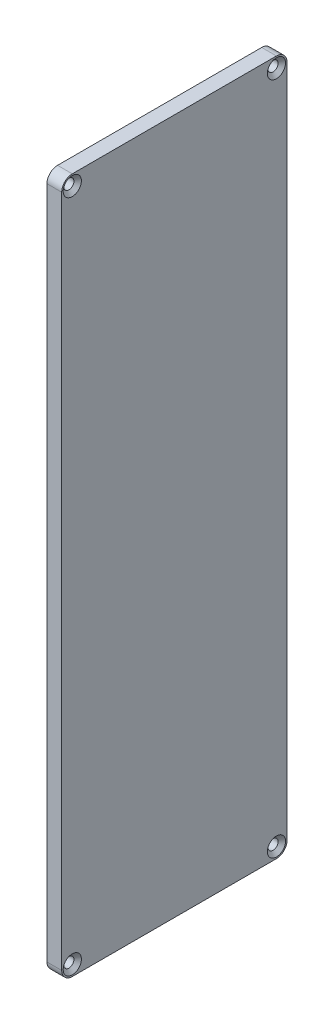
ISO-10303-21;
HEADER;
FILE_DESCRIPTION(('STEP AP214'),'2;1');
FILE_NAME('part.step','',(''),(''),'','','');
FILE_SCHEMA(('AUTOMOTIVE_DESIGN { 1 0 10303 214 1 1 1 1 }'));
ENDSEC;
DATA;
#1=APPLICATION_CONTEXT('core data for automotive mechanical design processes');
#2=APPLICATION_PROTOCOL_DEFINITION('international standard','automotive_design',2000,#1);
#3=PRODUCT_CONTEXT('',#1,'mechanical');
#4=PRODUCT('Part','Part','',(#3));
#5=PRODUCT_RELATED_PRODUCT_CATEGORY('part','',(#4));
#6=PRODUCT_DEFINITION_FORMATION('','',#4);
#7=PRODUCT_DEFINITION_CONTEXT('part definition',#1,'design');
#8=PRODUCT_DEFINITION('design','',#6,#7);
#9=PRODUCT_DEFINITION_SHAPE('','',#8);
#10=(LENGTH_UNIT() NAMED_UNIT(*) SI_UNIT(.MILLI.,.METRE.));
#11=(NAMED_UNIT(*) PLANE_ANGLE_UNIT() SI_UNIT($,.RADIAN.));
#12=(NAMED_UNIT(*) SI_UNIT($,.STERADIAN.) SOLID_ANGLE_UNIT());
#13=UNCERTAINTY_MEASURE_WITH_UNIT(LENGTH_MEASURE(1.E-05),#10,'distance_accuracy_value','');
#14=(GEOMETRIC_REPRESENTATION_CONTEXT(3) GLOBAL_UNCERTAINTY_ASSIGNED_CONTEXT((#13)) GLOBAL_UNIT_ASSIGNED_CONTEXT((#10,
#11,#12)) REPRESENTATION_CONTEXT('',''));
#15=CARTESIAN_POINT('',(0.,0.,0.));
#16=DIRECTION('',(0.,0.,1.));
#17=DIRECTION('',(1.,0.,0.));
#18=AXIS2_PLACEMENT_3D('',#15,#16,#17);
#19=CARTESIAN_POINT('',(151.859564679865,-68.6434992731308,22.0654459774263));
#20=DIRECTION('',(-1.,0.,0.));
#21=DIRECTION('',(0.,0.,1.));
#22=AXIS2_PLACEMENT_3D('',#19,#20,#21);
#23=CYLINDRICAL_SURFACE('',#22,2.159);
#24=CARTESIAN_POINT('',(3.,-68.6434992731308,22.0654459774263));
#25=DIRECTION('',(1.,0.,0.));
#26=DIRECTION('',(0.,0.,-1.));
#27=AXIS2_PLACEMENT_3D('',#24,#25,#26);
#28=CIRCLE('',#27,2.159);
#29=CARTESIAN_POINT('',(3.,-68.6434992731308,24.2244459774263));
#30=VERTEX_POINT('',#29);
#31=CARTESIAN_POINT('',(3.,-70.8024992731308,22.0654459774263));
#32=VERTEX_POINT('',#31);
#33=EDGE_CURVE('E151',#30,#32,#28,.T.);
#34=ORIENTED_EDGE('',*,*,#33,.F.);
#35=DIRECTION('',(-1.,0.,0.));
#36=VECTOR('',#35,1.);
#37=CARTESIAN_POINT('',(151.859564679865,-68.6434992731308,24.2244459774263));
#38=LINE('',#37,#36);
#39=CARTESIAN_POINT('',(0.,-68.6434992731308,24.2244459774263));
#40=VERTEX_POINT('',#39);
#41=EDGE_CURVE('E47',#30,#40,#38,.T.);
#42=ORIENTED_EDGE('',*,*,#41,.T.);
#43=CARTESIAN_POINT('',(0.,-68.6434992731308,22.0654459774263));
#44=DIRECTION('',(1.,0.,0.));
#45=DIRECTION('',(0.,0.,-1.));
#46=AXIS2_PLACEMENT_3D('',#43,#44,#45);
#47=CIRCLE('',#46,2.159);
#48=CARTESIAN_POINT('',(0.,-70.8024992731308,22.0654459774263));
#49=VERTEX_POINT('',#48);
#50=EDGE_CURVE('E165',#40,#49,#47,.T.);
#51=ORIENTED_EDGE('',*,*,#50,.T.);
#52=DIRECTION('',(-1.,0.,0.));
#53=VECTOR('',#52,1.);
#54=CARTESIAN_POINT('',(151.859564679865,-70.8024992731308,22.0654459774263));
#55=LINE('',#54,#53);
#56=EDGE_CURVE('E101',#32,#49,#55,.T.);
#57=ORIENTED_EDGE('',*,*,#56,.F.);
#58=EDGE_LOOP('',(#34,#42,#51,#57));
#59=FACE_BOUND('',#58,.T.);
#60=ADVANCED_FACE('F44',(#59),#23,.T.);
#61=CARTESIAN_POINT('',(151.859564679865,-70.8024992731308,22.0654459774263));
#62=DIRECTION('',(0.,1.,0.));
#63=DIRECTION('',(0.,0.,1.));
#64=AXIS2_PLACEMENT_3D('',#61,#62,#63);
#65=PLANE('',#64);
#66=DIRECTION('',(0.,0.,-1.));
#67=VECTOR('',#66,1.);
#68=CARTESIAN_POINT('',(3.,-70.8024992731308,22.0654459774263));
#69=LINE('',#68,#67);
#70=CARTESIAN_POINT('',(3.,-70.8024992731308,-19.5207410145249));
#71=VERTEX_POINT('',#70);
#72=EDGE_CURVE('E107',#32,#71,#69,.T.);
#73=ORIENTED_EDGE('',*,*,#72,.F.);
#74=ORIENTED_EDGE('',*,*,#56,.T.);
#75=DIRECTION('',(0.,0.,-1.));
#76=VECTOR('',#75,1.);
#77=CARTESIAN_POINT('',(0.,-70.8024992731308,22.0654459774263));
#78=LINE('',#77,#76);
#79=CARTESIAN_POINT('',(0.,-70.8024992731308,-19.5207410145249));
#80=VERTEX_POINT('',#79);
#81=EDGE_CURVE('E161',#49,#80,#78,.T.);
#82=ORIENTED_EDGE('',*,*,#81,.T.);
#83=DIRECTION('',(-1.,0.,0.));
#84=VECTOR('',#83,1.);
#85=CARTESIAN_POINT('',(151.859564679865,-70.8024992731308,-19.5207410145249));
#86=LINE('',#85,#84);
#87=EDGE_CURVE('E162',#71,#80,#86,.T.);
#88=ORIENTED_EDGE('',*,*,#87,.F.);
#89=EDGE_LOOP('',(#73,#74,#82,#88));
#90=FACE_BOUND('',#89,.T.);
#91=ADVANCED_FACE('F283',(#90),#65,.F.);
#92=CARTESIAN_POINT('',(151.859564679865,-68.6434992731308,-19.5207410145249));
#93=DIRECTION('',(-1.,0.,0.));
#94=DIRECTION('',(0.,0.,1.));
#95=AXIS2_PLACEMENT_3D('',#92,#93,#94);
#96=CYLINDRICAL_SURFACE('',#95,2.15899999999999);
#97=CARTESIAN_POINT('',(3.,-68.6434992731308,-19.5207410145249));
#98=DIRECTION('',(1.,0.,0.));
#99=DIRECTION('',(0.,0.,-1.));
#100=AXIS2_PLACEMENT_3D('',#97,#98,#99);
#101=CIRCLE('',#100,2.15899999999999);
#102=CARTESIAN_POINT('',(3.,-68.6434992731308,-21.6797410145249));
#103=VERTEX_POINT('',#102);
#104=EDGE_CURVE('E144',#71,#103,#101,.T.);
#105=ORIENTED_EDGE('',*,*,#104,.F.);
#106=ORIENTED_EDGE('',*,*,#87,.T.);
#107=CARTESIAN_POINT('',(0.,-68.6434992731308,-19.5207410145249));
#108=DIRECTION('',(1.,0.,0.));
#109=DIRECTION('',(0.,0.,-1.));
#110=AXIS2_PLACEMENT_3D('',#107,#108,#109);
#111=CIRCLE('',#110,2.15899999999999);
#112=CARTESIAN_POINT('',(0.,-68.6434992731308,-21.6797410145249));
#113=VERTEX_POINT('',#112);
#114=EDGE_CURVE('E167',#80,#113,#111,.T.);
#115=ORIENTED_EDGE('',*,*,#114,.T.);
#116=DIRECTION('',(-1.,0.,0.));
#117=VECTOR('',#116,1.);
#118=CARTESIAN_POINT('',(151.859564679865,-68.6434992731308,-21.6797410145249));
#119=LINE('',#118,#117);
#120=EDGE_CURVE('E170',#103,#113,#119,.T.);
#121=ORIENTED_EDGE('',*,*,#120,.F.);
#122=EDGE_LOOP('',(#105,#106,#115,#121));
#123=FACE_BOUND('',#122,.T.);
#124=ADVANCED_FACE('F281',(#123),#96,.T.);
#125=CARTESIAN_POINT('',(151.859564679865,-68.6434992731308,-21.6797410145249));
#126=DIRECTION('',(0.,0.,1.));
#127=DIRECTION('',(1.,0.,0.));
#128=AXIS2_PLACEMENT_3D('',#125,#126,#127);
#129=PLANE('',#128);
#130=DIRECTION('',(0.,1.,0.));
#131=VECTOR('',#130,1.);
#132=CARTESIAN_POINT('',(3.,-68.6434992731308,-21.6797410145249));
#133=LINE('',#132,#131);
#134=CARTESIAN_POINT('',(3.,68.6434992731308,-21.6797410145249));
#135=VERTEX_POINT('',#134);
#136=EDGE_CURVE('E138',#103,#135,#133,.T.);
#137=ORIENTED_EDGE('',*,*,#136,.F.);
#138=ORIENTED_EDGE('',*,*,#120,.T.);
#139=DIRECTION('',(0.,1.,0.));
#140=VECTOR('',#139,1.);
#141=CARTESIAN_POINT('',(0.,-68.6434992731308,-21.6797410145249));
#142=LINE('',#141,#140);
#143=CARTESIAN_POINT('',(0.,68.6434992731308,-21.6797410145249));
#144=VERTEX_POINT('',#143);
#145=EDGE_CURVE('E168',#113,#144,#142,.T.);
#146=ORIENTED_EDGE('',*,*,#145,.T.);
#147=DIRECTION('',(-1.,0.,0.));
#148=VECTOR('',#147,1.);
#149=CARTESIAN_POINT('',(151.859564679865,68.6434992731308,-21.6797410145249));
#150=LINE('',#149,#148);
#151=EDGE_CURVE('E173',#135,#144,#150,.T.);
#152=ORIENTED_EDGE('',*,*,#151,.F.);
#153=EDGE_LOOP('',(#137,#138,#146,#152));
#154=FACE_BOUND('',#153,.T.);
#155=ADVANCED_FACE('F289',(#154),#129,.F.);
#156=CARTESIAN_POINT('',(151.859564679865,68.6434992731308,-19.5207410145249));
#157=DIRECTION('',(-1.,0.,0.));
#158=DIRECTION('',(0.,0.,1.));
#159=AXIS2_PLACEMENT_3D('',#156,#157,#158);
#160=CYLINDRICAL_SURFACE('',#159,2.159);
#161=CARTESIAN_POINT('',(3.,68.6434992731308,-19.5207410145249));
#162=DIRECTION('',(1.,0.,0.));
#163=DIRECTION('',(0.,0.,-1.));
#164=AXIS2_PLACEMENT_3D('',#161,#162,#163);
#165=CIRCLE('',#164,2.159);
#166=CARTESIAN_POINT('',(3.,70.8024992731308,-19.5207410145249));
#167=VERTEX_POINT('',#166);
#168=EDGE_CURVE('E131',#135,#167,#165,.T.);
#169=ORIENTED_EDGE('',*,*,#168,.F.);
#170=ORIENTED_EDGE('',*,*,#151,.T.);
#171=CARTESIAN_POINT('',(0.,68.6434992731308,-19.5207410145249));
#172=DIRECTION('',(1.,0.,0.));
#173=DIRECTION('',(0.,0.,-1.));
#174=AXIS2_PLACEMENT_3D('',#171,#172,#173);
#175=CIRCLE('',#174,2.159);
#176=CARTESIAN_POINT('',(0.,70.8024992731308,-19.5207410145249));
#177=VERTEX_POINT('',#176);
#178=EDGE_CURVE('E175',#144,#177,#175,.T.);
#179=ORIENTED_EDGE('',*,*,#178,.T.);
#180=DIRECTION('',(-1.,0.,0.));
#181=VECTOR('',#180,1.);
#182=CARTESIAN_POINT('',(151.859564679865,70.8024992731308,-19.5207410145249));
#183=LINE('',#182,#181);
#184=EDGE_CURVE('E171',#167,#177,#183,.T.);
#185=ORIENTED_EDGE('',*,*,#184,.F.);
#186=EDGE_LOOP('',(#169,#170,#179,#185));
#187=FACE_BOUND('',#186,.T.);
#188=ADVANCED_FACE('F294',(#187),#160,.T.);
#189=CARTESIAN_POINT('',(151.859564679865,70.8024992731308,-19.5207410145249));
#190=DIRECTION('',(0.,-1.,0.));
#191=DIRECTION('',(0.,0.,-1.));
#192=AXIS2_PLACEMENT_3D('',#189,#190,#191);
#193=PLANE('',#192);
#194=DIRECTION('',(0.,0.,1.));
#195=VECTOR('',#194,1.);
#196=CARTESIAN_POINT('',(3.,70.8024992731308,-19.5207410145249));
#197=LINE('',#196,#195);
#198=CARTESIAN_POINT('',(3.,70.8024992731308,22.0654459774263));
#199=VERTEX_POINT('',#198);
#200=EDGE_CURVE('E54',#167,#199,#197,.T.);
#201=ORIENTED_EDGE('',*,*,#200,.F.);
#202=ORIENTED_EDGE('',*,*,#184,.T.);
#203=DIRECTION('',(0.,0.,1.));
#204=VECTOR('',#203,1.);
#205=CARTESIAN_POINT('',(0.,70.8024992731308,-19.5207410145249));
#206=LINE('',#205,#204);
#207=CARTESIAN_POINT('',(0.,70.8024992731308,22.0654459774263));
#208=VERTEX_POINT('',#207);
#209=EDGE_CURVE('E126',#177,#208,#206,.T.);
#210=ORIENTED_EDGE('',*,*,#209,.T.);
#211=DIRECTION('',(-1.,0.,0.));
#212=VECTOR('',#211,1.);
#213=CARTESIAN_POINT('',(151.859564679865,70.8024992731308,22.0654459774263));
#214=LINE('',#213,#212);
#215=EDGE_CURVE('E120',#199,#208,#214,.T.);
#216=ORIENTED_EDGE('',*,*,#215,.F.);
#217=EDGE_LOOP('',(#201,#202,#210,#216));
#218=FACE_BOUND('',#217,.T.);
#219=ADVANCED_FACE('F124',(#218),#193,.F.);
#220=CARTESIAN_POINT('',(151.859564679865,68.6434992731308,22.0654459774263));
#221=DIRECTION('',(-1.,0.,0.));
#222=DIRECTION('',(0.,0.,1.));
#223=AXIS2_PLACEMENT_3D('',#220,#221,#222);
#224=CYLINDRICAL_SURFACE('',#223,2.15900000000001);
#225=CARTESIAN_POINT('',(3.,68.6434992731308,22.0654459774263));
#226=DIRECTION('',(1.,0.,0.));
#227=DIRECTION('',(0.,0.,-1.));
#228=AXIS2_PLACEMENT_3D('',#225,#226,#227);
#229=CIRCLE('',#228,2.15900000000001);
#230=CARTESIAN_POINT('',(3.,68.6434992731308,24.2244459774263));
#231=VERTEX_POINT('',#230);
#232=EDGE_CURVE('E11',#199,#231,#229,.T.);
#233=ORIENTED_EDGE('',*,*,#232,.F.);
#234=ORIENTED_EDGE('',*,*,#215,.T.);
#235=CARTESIAN_POINT('',(0.,68.6434992731308,22.0654459774263));
#236=DIRECTION('',(1.,0.,0.));
#237=DIRECTION('',(0.,0.,-1.));
#238=AXIS2_PLACEMENT_3D('',#235,#236,#237);
#239=CIRCLE('',#238,2.15900000000001);
#240=CARTESIAN_POINT('',(0.,68.6434992731308,24.2244459774263));
#241=VERTEX_POINT('',#240);
#242=EDGE_CURVE('E133',#208,#241,#239,.T.);
#243=ORIENTED_EDGE('',*,*,#242,.T.);
#244=DIRECTION('',(-1.,0.,0.));
#245=VECTOR('',#244,1.);
#246=CARTESIAN_POINT('',(151.859564679865,68.6434992731308,24.2244459774263));
#247=LINE('',#246,#245);
#248=EDGE_CURVE('E67',#231,#241,#247,.T.);
#249=ORIENTED_EDGE('',*,*,#248,.F.);
#250=EDGE_LOOP('',(#233,#234,#243,#249));
#251=FACE_BOUND('',#250,.T.);
#252=ADVANCED_FACE('F117',(#251),#224,.T.);
#253=CARTESIAN_POINT('',(151.859564679865,68.6434992731308,24.2244459774263));
#254=DIRECTION('',(0.,0.,-1.));
#255=DIRECTION('',(0.,1.,0.));
#256=AXIS2_PLACEMENT_3D('',#253,#254,#255);
#257=PLANE('',#256);
#258=DIRECTION('',(0.,-1.,0.));
#259=VECTOR('',#258,1.);
#260=CARTESIAN_POINT('',(3.,68.6434992731308,24.2244459774263));
#261=LINE('',#260,#259);
#262=EDGE_CURVE('E154',#231,#30,#261,.T.);
#263=ORIENTED_EDGE('',*,*,#262,.F.);
#264=ORIENTED_EDGE('',*,*,#248,.T.);
#265=DIRECTION('',(0.,-1.,0.));
#266=VECTOR('',#265,1.);
#267=CARTESIAN_POINT('',(0.,68.6434992731308,24.2244459774263));
#268=LINE('',#267,#266);
#269=EDGE_CURVE('E158',#241,#40,#268,.T.);
#270=ORIENTED_EDGE('',*,*,#269,.T.);
#271=ORIENTED_EDGE('',*,*,#41,.F.);
#272=EDGE_LOOP('',(#263,#264,#270,#271));
#273=FACE_BOUND('',#272,.T.);
#274=ADVANCED_FACE('F302',(#273),#257,.F.);
#275=CARTESIAN_POINT('',(0.,-68.6434992731308,22.0654459774263));
#276=DIRECTION('',(1.,0.,0.));
#277=DIRECTION('',(0.,0.,-1.));
#278=AXIS2_PLACEMENT_3D('',#275,#276,#277);
#279=PLANE('',#278);
#280=CARTESIAN_POINT('',(0.,68.6434992731308,22.0654459774263));
#281=DIRECTION('',(1.,0.,0.));
#282=DIRECTION('',(0.,0.,-1.));
#283=AXIS2_PLACEMENT_3D('',#280,#281,#282);
#284=CIRCLE('',#283,1.02869999999999);
#285=CARTESIAN_POINT('',(0.,68.6434992731308,21.0367459774263));
#286=VERTEX_POINT('',#285);
#287=EDGE_CURVE('E238',#286,#286,#284,.T.);
#288=ORIENTED_EDGE('',*,*,#287,.T.);
#289=EDGE_LOOP('',(#288));
#290=FACE_BOUND('',#289,.T.);
#291=CARTESIAN_POINT('',(0.,68.6434992731308,-19.5207410145249));
#292=DIRECTION('',(1.,0.,0.));
#293=DIRECTION('',(0.,0.,-1.));
#294=AXIS2_PLACEMENT_3D('',#291,#292,#293);
#295=CIRCLE('',#294,1.02869999999999);
#296=CARTESIAN_POINT('',(0.,68.6434992731308,-20.5494410145249));
#297=VERTEX_POINT('',#296);
#298=EDGE_CURVE('E227',#297,#297,#295,.T.);
#299=ORIENTED_EDGE('',*,*,#298,.T.);
#300=EDGE_LOOP('',(#299));
#301=FACE_BOUND('',#300,.T.);
#302=CARTESIAN_POINT('',(0.,-68.6434992731308,-19.5207410145249));
#303=DIRECTION('',(1.,0.,0.));
#304=DIRECTION('',(0.,0.,-1.));
#305=AXIS2_PLACEMENT_3D('',#302,#303,#304);
#306=CIRCLE('',#305,1.02869999999999);
#307=CARTESIAN_POINT('',(0.,-68.6434992731308,-20.5494410145249));
#308=VERTEX_POINT('',#307);
#309=EDGE_CURVE('E216',#308,#308,#306,.T.);
#310=ORIENTED_EDGE('',*,*,#309,.T.);
#311=EDGE_LOOP('',(#310));
#312=FACE_BOUND('',#311,.T.);
#313=CARTESIAN_POINT('',(0.,-68.6434992731308,22.0654459774263));
#314=DIRECTION('',(1.,0.,0.));
#315=DIRECTION('',(0.,0.,-1.));
#316=AXIS2_PLACEMENT_3D('',#313,#314,#315);
#317=CIRCLE('',#316,1.02869999999999);
#318=CARTESIAN_POINT('',(0.,-68.6434992731308,21.0367459774263));
#319=VERTEX_POINT('',#318);
#320=EDGE_CURVE('E205',#319,#319,#317,.T.);
#321=ORIENTED_EDGE('',*,*,#320,.T.);
#322=EDGE_LOOP('',(#321));
#323=FACE_BOUND('',#322,.T.);
#324=ORIENTED_EDGE('',*,*,#50,.F.);
#325=ORIENTED_EDGE('',*,*,#269,.F.);
#326=ORIENTED_EDGE('',*,*,#242,.F.);
#327=ORIENTED_EDGE('',*,*,#209,.F.);
#328=ORIENTED_EDGE('',*,*,#178,.F.);
#329=ORIENTED_EDGE('',*,*,#145,.F.);
#330=ORIENTED_EDGE('',*,*,#114,.F.);
#331=ORIENTED_EDGE('',*,*,#81,.F.);
#332=EDGE_LOOP('',(#324,#325,#326,#327,#328,#329,#330,#331));
#333=FACE_BOUND('',#332,.T.);
#334=ADVANCED_FACE('F256',(#290,#301,#312,#323,#333),#279,.F.);
#335=CARTESIAN_POINT('',(3.,74.9934992731308,7.5));
#336=DIRECTION('',(1.,0.,0.));
#337=DIRECTION('',(0.,0.,-1.));
#338=AXIS2_PLACEMENT_3D('',#335,#336,#337);
#339=PLANE('',#338);
#340=CARTESIAN_POINT('',(3.,68.6434992731308,22.0654459774263));
#341=DIRECTION('',(1.,0.,0.));
#342=DIRECTION('',(0.,0.,-1.));
#343=AXIS2_PLACEMENT_3D('',#340,#341,#342);
#344=CIRCLE('',#343,1.8542);
#345=CARTESIAN_POINT('',(3.,68.6434992731308,20.2112459774263));
#346=VERTEX_POINT('',#345);
#347=EDGE_CURVE('E247',#346,#346,#344,.T.);
#348=ORIENTED_EDGE('',*,*,#347,.F.);
#349=EDGE_LOOP('',(#348));
#350=FACE_BOUND('',#349,.T.);
#351=CARTESIAN_POINT('',(3.,68.6434992731308,-19.5207410145249));
#352=DIRECTION('',(1.,0.,0.));
#353=DIRECTION('',(0.,0.,-1.));
#354=AXIS2_PLACEMENT_3D('',#351,#352,#353);
#355=CIRCLE('',#354,1.8542);
#356=CARTESIAN_POINT('',(3.,68.6434992731308,-21.3749410145249));
#357=VERTEX_POINT('',#356);
#358=EDGE_CURVE('E237',#357,#357,#355,.T.);
#359=ORIENTED_EDGE('',*,*,#358,.F.);
#360=EDGE_LOOP('',(#359));
#361=FACE_BOUND('',#360,.T.);
#362=CARTESIAN_POINT('',(3.,-68.6434992731308,-19.5207410145249));
#363=DIRECTION('',(1.,0.,0.));
#364=DIRECTION('',(0.,0.,-1.));
#365=AXIS2_PLACEMENT_3D('',#362,#363,#364);
#366=CIRCLE('',#365,1.8542);
#367=CARTESIAN_POINT('',(3.,-68.6434992731308,-21.3749410145249));
#368=VERTEX_POINT('',#367);
#369=EDGE_CURVE('E221',#368,#368,#366,.T.);
#370=ORIENTED_EDGE('',*,*,#369,.F.);
#371=EDGE_LOOP('',(#370));
#372=FACE_BOUND('',#371,.T.);
#373=CARTESIAN_POINT('',(3.,-68.6434992731308,22.0654459774263));
#374=DIRECTION('',(1.,0.,0.));
#375=DIRECTION('',(0.,0.,-1.));
#376=AXIS2_PLACEMENT_3D('',#373,#374,#375);
#377=CIRCLE('',#376,1.8542);
#378=CARTESIAN_POINT('',(3.,-68.6434992731308,20.2112459774263));
#379=VERTEX_POINT('',#378);
#380=EDGE_CURVE('E209',#379,#379,#377,.T.);
#381=ORIENTED_EDGE('',*,*,#380,.F.);
#382=EDGE_LOOP('',(#381));
#383=FACE_BOUND('',#382,.T.);
#384=ORIENTED_EDGE('',*,*,#262,.T.);
#385=ORIENTED_EDGE('',*,*,#33,.T.);
#386=ORIENTED_EDGE('',*,*,#72,.T.);
#387=ORIENTED_EDGE('',*,*,#104,.T.);
#388=ORIENTED_EDGE('',*,*,#136,.T.);
#389=ORIENTED_EDGE('',*,*,#168,.T.);
#390=ORIENTED_EDGE('',*,*,#200,.T.);
#391=ORIENTED_EDGE('',*,*,#232,.T.);
#392=EDGE_LOOP('',(#384,#385,#386,#387,#388,#389,#390,#391));
#393=FACE_BOUND('',#392,.T.);
#394=ADVANCED_FACE('F50',(#350,#361,#372,#383,#393),#339,.T.);
#395=CARTESIAN_POINT('',(3.,-68.6434992731308,22.0654459774263));
#396=DIRECTION('',(1.,0.,0.));
#397=DIRECTION('',(0.,0.,-1.));
#398=AXIS2_PLACEMENT_3D('',#395,#396,#397);
#399=CYLINDRICAL_SURFACE('',#398,1.02869999999999);
#400=ORIENTED_EDGE('',*,*,#320,.F.);
#401=EDGE_LOOP('',(#400));
#402=FACE_BOUND('',#401,.T.);
#403=CARTESIAN_POINT('',(2.30732325446316,-68.6434992731308,22.0654459774263));
#404=DIRECTION('',(1.,0.,0.));
#405=DIRECTION('',(0.,0.,-1.));
#406=AXIS2_PLACEMENT_3D('',#403,#404,#405);
#407=CIRCLE('',#406,1.02869999999999);
#408=CARTESIAN_POINT('',(2.30732325446316,-68.6434992731308,21.0367459774263));
#409=VERTEX_POINT('',#408);
#410=EDGE_CURVE('E202',#409,#409,#407,.T.);
#411=ORIENTED_EDGE('',*,*,#410,.T.);
#412=EDGE_LOOP('',(#411));
#413=FACE_BOUND('',#412,.T.);
#414=ADVANCED_FACE('F260',(#402,#413),#399,.F.);
#415=CARTESIAN_POINT('',(3.,-68.6434992731308,22.0654459774263));
#416=DIRECTION('',(1.,0.,0.));
#417=DIRECTION('',(0.,0.,-1.));
#418=AXIS2_PLACEMENT_3D('',#415,#416,#417);
#419=CONICAL_SURFACE('',#418,1.8542,0.872664625997168);
#420=ORIENTED_EDGE('',*,*,#410,.F.);
#421=EDGE_LOOP('',(#420));
#422=FACE_BOUND('',#421,.T.);
#423=ORIENTED_EDGE('',*,*,#380,.T.);
#424=EDGE_LOOP('',(#423));
#425=FACE_BOUND('',#424,.T.);
#426=ADVANCED_FACE('F264',(#422,#425),#419,.F.);
#427=CARTESIAN_POINT('',(3.,-68.6434992731308,-19.5207410145249));
#428=DIRECTION('',(1.,0.,0.));
#429=DIRECTION('',(0.,0.,-1.));
#430=AXIS2_PLACEMENT_3D('',#427,#428,#429);
#431=CYLINDRICAL_SURFACE('',#430,1.02869999999999);
#432=ORIENTED_EDGE('',*,*,#309,.F.);
#433=EDGE_LOOP('',(#432));
#434=FACE_BOUND('',#433,.T.);
#435=CARTESIAN_POINT('',(2.30732325446316,-68.6434992731308,-19.5207410145249));
#436=DIRECTION('',(1.,0.,0.));
#437=DIRECTION('',(0.,0.,-1.));
#438=AXIS2_PLACEMENT_3D('',#435,#436,#437);
#439=CIRCLE('',#438,1.02869999999999);
#440=CARTESIAN_POINT('',(2.30732325446316,-68.6434992731308,-20.5494410145249));
#441=VERTEX_POINT('',#440);
#442=EDGE_CURVE('E219',#441,#441,#439,.T.);
#443=ORIENTED_EDGE('',*,*,#442,.T.);
#444=EDGE_LOOP('',(#443));
#445=FACE_BOUND('',#444,.T.);
#446=ADVANCED_FACE('F270',(#434,#445),#431,.F.);
#447=CARTESIAN_POINT('',(3.,-68.6434992731308,-19.5207410145249));
#448=DIRECTION('',(1.,0.,0.));
#449=DIRECTION('',(0.,0.,-1.));
#450=AXIS2_PLACEMENT_3D('',#447,#448,#449);
#451=CONICAL_SURFACE('',#450,1.8542,0.872664625997168);
#452=ORIENTED_EDGE('',*,*,#442,.F.);
#453=EDGE_LOOP('',(#452));
#454=FACE_BOUND('',#453,.T.);
#455=ORIENTED_EDGE('',*,*,#369,.T.);
#456=EDGE_LOOP('',(#455));
#457=FACE_BOUND('',#456,.T.);
#458=ADVANCED_FACE('F273',(#454,#457),#451,.F.);
#459=CARTESIAN_POINT('',(3.,68.6434992731308,-19.5207410145249));
#460=DIRECTION('',(1.,0.,0.));
#461=DIRECTION('',(0.,0.,-1.));
#462=AXIS2_PLACEMENT_3D('',#459,#460,#461);
#463=CYLINDRICAL_SURFACE('',#462,1.02869999999999);
#464=ORIENTED_EDGE('',*,*,#298,.F.);
#465=EDGE_LOOP('',(#464));
#466=FACE_BOUND('',#465,.T.);
#467=CARTESIAN_POINT('',(2.30732325446316,68.6434992731308,-19.5207410145249));
#468=DIRECTION('',(1.,0.,0.));
#469=DIRECTION('',(0.,0.,-1.));
#470=AXIS2_PLACEMENT_3D('',#467,#468,#469);
#471=CIRCLE('',#470,1.02869999999999);
#472=CARTESIAN_POINT('',(2.30732325446316,68.6434992731308,-20.5494410145249));
#473=VERTEX_POINT('',#472);
#474=EDGE_CURVE('E235',#473,#473,#471,.T.);
#475=ORIENTED_EDGE('',*,*,#474,.T.);
#476=EDGE_LOOP('',(#475));
#477=FACE_BOUND('',#476,.T.);
#478=ADVANCED_FACE('F326',(#466,#477),#463,.F.);
#479=CARTESIAN_POINT('',(3.,68.6434992731308,-19.5207410145249));
#480=DIRECTION('',(1.,0.,0.));
#481=DIRECTION('',(0.,0.,-1.));
#482=AXIS2_PLACEMENT_3D('',#479,#480,#481);
#483=CONICAL_SURFACE('',#482,1.8542,0.872664625997168);
#484=ORIENTED_EDGE('',*,*,#474,.F.);
#485=EDGE_LOOP('',(#484));
#486=FACE_BOUND('',#485,.T.);
#487=ORIENTED_EDGE('',*,*,#358,.T.);
#488=EDGE_LOOP('',(#487));
#489=FACE_BOUND('',#488,.T.);
#490=ADVANCED_FACE('F332',(#486,#489),#483,.F.);
#491=CARTESIAN_POINT('',(3.,68.6434992731308,22.0654459774263));
#492=DIRECTION('',(1.,0.,0.));
#493=DIRECTION('',(0.,0.,-1.));
#494=AXIS2_PLACEMENT_3D('',#491,#492,#493);
#495=CYLINDRICAL_SURFACE('',#494,1.02869999999999);
#496=ORIENTED_EDGE('',*,*,#287,.F.);
#497=EDGE_LOOP('',(#496));
#498=FACE_BOUND('',#497,.T.);
#499=CARTESIAN_POINT('',(2.30732325446316,68.6434992731308,22.0654459774263));
#500=DIRECTION('',(1.,0.,0.));
#501=DIRECTION('',(0.,0.,-1.));
#502=AXIS2_PLACEMENT_3D('',#499,#500,#501);
#503=CIRCLE('',#502,1.02869999999999);
#504=CARTESIAN_POINT('',(2.30732325446316,68.6434992731308,21.0367459774263));
#505=VERTEX_POINT('',#504);
#506=EDGE_CURVE('E245',#505,#505,#503,.T.);
#507=ORIENTED_EDGE('',*,*,#506,.T.);
#508=EDGE_LOOP('',(#507));
#509=FACE_BOUND('',#508,.T.);
#510=ADVANCED_FACE('F339',(#498,#509),#495,.F.);
#511=CARTESIAN_POINT('',(3.,68.6434992731308,22.0654459774263));
#512=DIRECTION('',(1.,0.,0.));
#513=DIRECTION('',(0.,0.,-1.));
#514=AXIS2_PLACEMENT_3D('',#511,#512,#513);
#515=CONICAL_SURFACE('',#514,1.8542,0.872664625997168);
#516=ORIENTED_EDGE('',*,*,#506,.F.);
#517=EDGE_LOOP('',(#516));
#518=FACE_BOUND('',#517,.T.);
#519=ORIENTED_EDGE('',*,*,#347,.T.);
#520=EDGE_LOOP('',(#519));
#521=FACE_BOUND('',#520,.T.);
#522=ADVANCED_FACE('F251',(#518,#521),#515,.F.);
#523=CLOSED_SHELL('',(#60,#91,#124,#155,#188,#219,#252,#274,#334,#394,#414,#426,#446,#458,#478,
#490,#510,#522));
#524=MANIFOLD_SOLID_BREP('B2',#523);
#525=ADVANCED_BREP_SHAPE_REPRESENTATION('',(#18,#524),#14);
#526=SHAPE_DEFINITION_REPRESENTATION(#9,#525);
ENDSEC;
END-ISO-10303-21;
